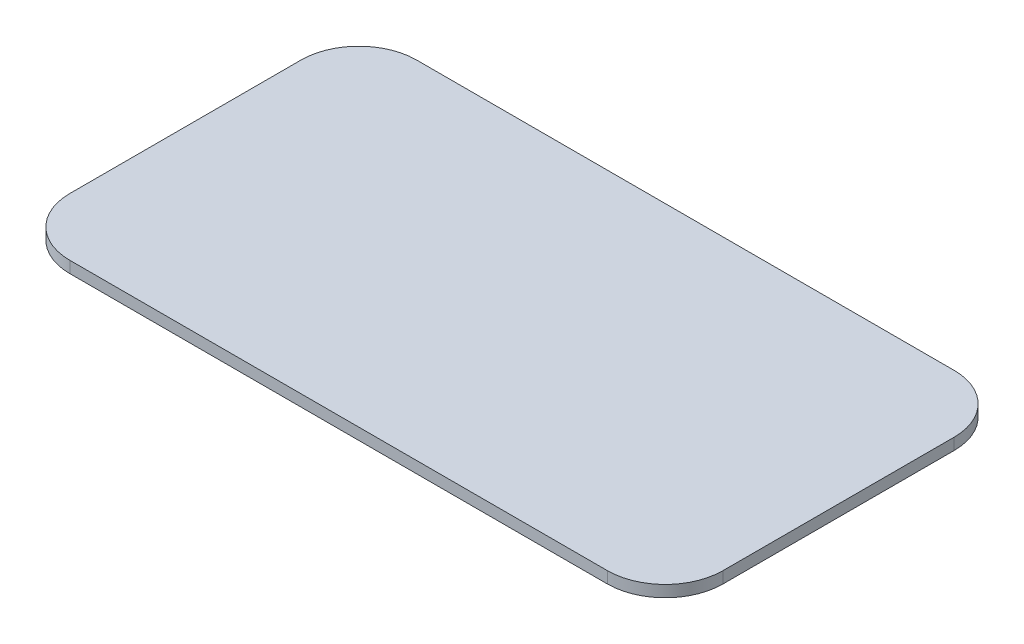
ISO-10303-21;
HEADER;
FILE_DESCRIPTION(('STEP AP214'),'2;1');
FILE_NAME('part.step','',(''),(''),'','','');
FILE_SCHEMA(('AUTOMOTIVE_DESIGN { 1 0 10303 214 1 1 1 1 }'));
ENDSEC;
DATA;
#1=APPLICATION_CONTEXT('core data for automotive mechanical design processes');
#2=APPLICATION_PROTOCOL_DEFINITION('international standard','automotive_design',2000,#1);
#3=PRODUCT_CONTEXT('',#1,'mechanical');
#4=PRODUCT('Part','Part','',(#3));
#5=PRODUCT_RELATED_PRODUCT_CATEGORY('part','',(#4));
#6=PRODUCT_DEFINITION_FORMATION('','',#4);
#7=PRODUCT_DEFINITION_CONTEXT('part definition',#1,'design');
#8=PRODUCT_DEFINITION('design','',#6,#7);
#9=PRODUCT_DEFINITION_SHAPE('','',#8);
#10=(LENGTH_UNIT() NAMED_UNIT(*) SI_UNIT(.MILLI.,.METRE.));
#11=(NAMED_UNIT(*) PLANE_ANGLE_UNIT() SI_UNIT($,.RADIAN.));
#12=(NAMED_UNIT(*) SI_UNIT($,.STERADIAN.) SOLID_ANGLE_UNIT());
#13=UNCERTAINTY_MEASURE_WITH_UNIT(LENGTH_MEASURE(1.E-05),#10,'distance_accuracy_value','');
#14=(GEOMETRIC_REPRESENTATION_CONTEXT(3) GLOBAL_UNCERTAINTY_ASSIGNED_CONTEXT((#13)) GLOBAL_UNIT_ASSIGNED_CONTEXT((#10,
#11,#12)) REPRESENTATION_CONTEXT('',''));
#15=CARTESIAN_POINT('',(0.,0.,0.));
#16=DIRECTION('',(0.,0.,1.));
#17=DIRECTION('',(1.,0.,0.));
#18=AXIS2_PLACEMENT_3D('',#15,#16,#17);
#19=CARTESIAN_POINT('',(79.785498489426,2.,-5.53323262839879));
#20=DIRECTION('',(0.,-1.,0.));
#21=DIRECTION('',(0.,0.,-1.));
#22=AXIS2_PLACEMENT_3D('',#19,#20,#21);
#23=CYLINDRICAL_SURFACE('',#22,10.);
#24=CARTESIAN_POINT('',(79.785498489426,0.,-5.53323262839879));
#25=DIRECTION('',(0.,1.,0.));
#26=DIRECTION('',(0.,0.,1.));
#27=AXIS2_PLACEMENT_3D('',#24,#25,#26);
#28=CIRCLE('',#27,10.);
#29=CARTESIAN_POINT('',(89.785498489426,0.,-5.53323262839872));
#30=VERTEX_POINT('',#29);
#31=CARTESIAN_POINT('',(79.7854984894259,0.,-15.5332326283988));
#32=VERTEX_POINT('',#31);
#33=EDGE_CURVE('E130',#30,#32,#28,.T.);
#34=ORIENTED_EDGE('',*,*,#33,.T.);
#35=DIRECTION('',(0.,-1.,0.));
#36=VECTOR('',#35,1.);
#37=CARTESIAN_POINT('',(79.7854984894259,2.,-15.5332326283988));
#38=LINE('',#37,#36);
#39=CARTESIAN_POINT('',(79.7854984894259,2.,-15.5332326283988));
#40=VERTEX_POINT('',#39);
#41=EDGE_CURVE('E11',#40,#32,#38,.T.);
#42=ORIENTED_EDGE('',*,*,#41,.F.);
#43=CARTESIAN_POINT('',(79.785498489426,2.,-5.53323262839879));
#44=DIRECTION('',(0.,1.,0.));
#45=DIRECTION('',(0.,0.,1.));
#46=AXIS2_PLACEMENT_3D('',#43,#44,#45);
#47=CIRCLE('',#46,10.);
#48=CARTESIAN_POINT('',(89.785498489426,2.,-5.53323262839872));
#49=VERTEX_POINT('',#48);
#50=EDGE_CURVE('E144',#49,#40,#47,.T.);
#51=ORIENTED_EDGE('',*,*,#50,.F.);
#52=DIRECTION('',(0.,-1.,0.));
#53=VECTOR('',#52,1.);
#54=CARTESIAN_POINT('',(89.785498489426,2.,-5.53323262839872));
#55=LINE('',#54,#53);
#56=EDGE_CURVE('E126',#49,#30,#55,.T.);
#57=ORIENTED_EDGE('',*,*,#56,.T.);
#58=EDGE_LOOP('',(#34,#42,#51,#57));
#59=FACE_BOUND('',#58,.T.);
#60=ADVANCED_FACE('F34',(#59),#23,.T.);
#61=CARTESIAN_POINT('',(-13.214501510574,2.,-15.5332326283988));
#62=DIRECTION('',(0.,0.,1.));
#63=DIRECTION('',(1.,0.,0.));
#64=AXIS2_PLACEMENT_3D('',#61,#62,#63);
#65=PLANE('',#64);
#66=DIRECTION('',(-1.,0.,0.));
#67=VECTOR('',#66,1.);
#68=CARTESIAN_POINT('',(-13.214501510574,0.,-15.5332326283988));
#69=LINE('',#68,#67);
#70=CARTESIAN_POINT('',(-13.214501510574,0.,-15.5332326283988));
#71=VERTEX_POINT('',#70);
#72=EDGE_CURVE('E133',#32,#71,#69,.T.);
#73=ORIENTED_EDGE('',*,*,#72,.T.);
#74=DIRECTION('',(0.,-1.,0.));
#75=VECTOR('',#74,1.);
#76=CARTESIAN_POINT('',(-13.214501510574,2.,-15.5332326283988));
#77=LINE('',#76,#75);
#78=CARTESIAN_POINT('',(-13.214501510574,2.,-15.5332326283988));
#79=VERTEX_POINT('',#78);
#80=EDGE_CURVE('E42',#79,#71,#77,.T.);
#81=ORIENTED_EDGE('',*,*,#80,.F.);
#82=DIRECTION('',(-1.,0.,0.));
#83=VECTOR('',#82,1.);
#84=CARTESIAN_POINT('',(-13.214501510574,2.,-15.5332326283988));
#85=LINE('',#84,#83);
#86=EDGE_CURVE('E93',#40,#79,#85,.T.);
#87=ORIENTED_EDGE('',*,*,#86,.F.);
#88=ORIENTED_EDGE('',*,*,#41,.T.);
#89=EDGE_LOOP('',(#73,#81,#87,#88));
#90=FACE_BOUND('',#89,.T.);
#91=ADVANCED_FACE('F179',(#90),#65,.F.);
#92=CARTESIAN_POINT('',(-13.214501510574,2.,-5.5332326283988));
#93=DIRECTION('',(0.,-1.,0.));
#94=DIRECTION('',(0.,0.,-1.));
#95=AXIS2_PLACEMENT_3D('',#92,#93,#94);
#96=CYLINDRICAL_SURFACE('',#95,10.);
#97=CARTESIAN_POINT('',(-13.214501510574,0.,-5.5332326283988));
#98=DIRECTION('',(0.,1.,0.));
#99=DIRECTION('',(0.,0.,-1.));
#100=AXIS2_PLACEMENT_3D('',#97,#98,#99);
#101=CIRCLE('',#100,10.);
#102=CARTESIAN_POINT('',(-23.214501510574,0.,-5.53323262839872));
#103=VERTEX_POINT('',#102);
#104=EDGE_CURVE('E135',#71,#103,#101,.T.);
#105=ORIENTED_EDGE('',*,*,#104,.T.);
#106=DIRECTION('',(0.,-1.,0.));
#107=VECTOR('',#106,1.);
#108=CARTESIAN_POINT('',(-23.214501510574,2.,-5.53323262839872));
#109=LINE('',#108,#107);
#110=CARTESIAN_POINT('',(-23.214501510574,2.,-5.53323262839872));
#111=VERTEX_POINT('',#110);
#112=EDGE_CURVE('E151',#111,#103,#109,.T.);
#113=ORIENTED_EDGE('',*,*,#112,.F.);
#114=CARTESIAN_POINT('',(-13.214501510574,2.,-5.5332326283988));
#115=DIRECTION('',(0.,1.,0.));
#116=DIRECTION('',(0.,0.,-1.));
#117=AXIS2_PLACEMENT_3D('',#114,#115,#116);
#118=CIRCLE('',#117,10.);
#119=EDGE_CURVE('E159',#79,#111,#118,.T.);
#120=ORIENTED_EDGE('',*,*,#119,.F.);
#121=ORIENTED_EDGE('',*,*,#80,.T.);
#122=EDGE_LOOP('',(#105,#113,#120,#121));
#123=FACE_BOUND('',#122,.T.);
#124=ADVANCED_FACE('F157',(#123),#96,.T.);
#125=CARTESIAN_POINT('',(-23.214501510574,2.,-5.53323262839872));
#126=DIRECTION('',(1.,0.,0.));
#127=DIRECTION('',(0.,0.,-1.));
#128=AXIS2_PLACEMENT_3D('',#125,#126,#127);
#129=PLANE('',#128);
#130=DIRECTION('',(0.,0.,1.));
#131=VECTOR('',#130,1.);
#132=CARTESIAN_POINT('',(-23.214501510574,0.,-5.53323262839872));
#133=LINE('',#132,#131);
#134=CARTESIAN_POINT('',(-23.214501510574,0.,34.4667673716011));
#135=VERTEX_POINT('',#134);
#136=EDGE_CURVE('E137',#103,#135,#133,.T.);
#137=ORIENTED_EDGE('',*,*,#136,.T.);
#138=DIRECTION('',(0.,-1.,0.));
#139=VECTOR('',#138,1.);
#140=CARTESIAN_POINT('',(-23.214501510574,2.,34.4667673716011));
#141=LINE('',#140,#139);
#142=CARTESIAN_POINT('',(-23.214501510574,2.,34.4667673716011));
#143=VERTEX_POINT('',#142);
#144=EDGE_CURVE('E148',#143,#135,#141,.T.);
#145=ORIENTED_EDGE('',*,*,#144,.F.);
#146=DIRECTION('',(0.,0.,1.));
#147=VECTOR('',#146,1.);
#148=CARTESIAN_POINT('',(-23.214501510574,2.,-5.53323262839872));
#149=LINE('',#148,#147);
#150=EDGE_CURVE('E171',#111,#143,#149,.T.);
#151=ORIENTED_EDGE('',*,*,#150,.F.);
#152=ORIENTED_EDGE('',*,*,#112,.T.);
#153=EDGE_LOOP('',(#137,#145,#151,#152));
#154=FACE_BOUND('',#153,.T.);
#155=ADVANCED_FACE('F167',(#154),#129,.F.);
#156=CARTESIAN_POINT('',(-13.214501510574,2.,34.4667673716012));
#157=DIRECTION('',(0.,-1.,0.));
#158=DIRECTION('',(0.,0.,-1.));
#159=AXIS2_PLACEMENT_3D('',#156,#157,#158);
#160=CYLINDRICAL_SURFACE('',#159,10.);
#161=CARTESIAN_POINT('',(-13.214501510574,0.,34.4667673716012));
#162=DIRECTION('',(0.,1.,0.));
#163=DIRECTION('',(0.,0.,-1.));
#164=AXIS2_PLACEMENT_3D('',#161,#162,#163);
#165=CIRCLE('',#164,10.);
#166=CARTESIAN_POINT('',(-13.214501510574,0.,44.4667673716012));
#167=VERTEX_POINT('',#166);
#168=EDGE_CURVE('E139',#135,#167,#165,.T.);
#169=ORIENTED_EDGE('',*,*,#168,.T.);
#170=DIRECTION('',(0.,-1.,0.));
#171=VECTOR('',#170,1.);
#172=CARTESIAN_POINT('',(-13.214501510574,2.,44.4667673716012));
#173=LINE('',#172,#171);
#174=CARTESIAN_POINT('',(-13.214501510574,2.,44.4667673716012));
#175=VERTEX_POINT('',#174);
#176=EDGE_CURVE('E121',#175,#167,#173,.T.);
#177=ORIENTED_EDGE('',*,*,#176,.F.);
#178=CARTESIAN_POINT('',(-13.214501510574,2.,34.4667673716012));
#179=DIRECTION('',(0.,1.,0.));
#180=DIRECTION('',(0.,0.,-1.));
#181=AXIS2_PLACEMENT_3D('',#178,#179,#180);
#182=CIRCLE('',#181,10.);
#183=EDGE_CURVE('E112',#143,#175,#182,.T.);
#184=ORIENTED_EDGE('',*,*,#183,.F.);
#185=ORIENTED_EDGE('',*,*,#144,.T.);
#186=EDGE_LOOP('',(#169,#177,#184,#185));
#187=FACE_BOUND('',#186,.T.);
#188=ADVANCED_FACE('F170',(#187),#160,.T.);
#189=CARTESIAN_POINT('',(-13.214501510574,2.,44.4667673716012));
#190=DIRECTION('',(0.,0.,-1.));
#191=DIRECTION('',(-1.,0.,0.));
#192=AXIS2_PLACEMENT_3D('',#189,#190,#191);
#193=PLANE('',#192);
#194=DIRECTION('',(1.,0.,0.));
#195=VECTOR('',#194,1.);
#196=CARTESIAN_POINT('',(-13.214501510574,0.,44.4667673716012));
#197=LINE('',#196,#195);
#198=CARTESIAN_POINT('',(79.7854984894259,0.,44.4667673716012));
#199=VERTEX_POINT('',#198);
#200=EDGE_CURVE('E120',#167,#199,#197,.T.);
#201=ORIENTED_EDGE('',*,*,#200,.T.);
#202=DIRECTION('',(0.,-1.,0.));
#203=VECTOR('',#202,1.);
#204=CARTESIAN_POINT('',(79.7854984894259,2.,44.4667673716012));
#205=LINE('',#204,#203);
#206=CARTESIAN_POINT('',(79.7854984894259,2.,44.4667673716012));
#207=VERTEX_POINT('',#206);
#208=EDGE_CURVE('E117',#207,#199,#205,.T.);
#209=ORIENTED_EDGE('',*,*,#208,.F.);
#210=DIRECTION('',(1.,0.,0.));
#211=VECTOR('',#210,1.);
#212=CARTESIAN_POINT('',(-13.214501510574,2.,44.4667673716012));
#213=LINE('',#212,#211);
#214=EDGE_CURVE('E106',#175,#207,#213,.T.);
#215=ORIENTED_EDGE('',*,*,#214,.F.);
#216=ORIENTED_EDGE('',*,*,#176,.T.);
#217=EDGE_LOOP('',(#201,#209,#215,#216));
#218=FACE_BOUND('',#217,.T.);
#219=ADVANCED_FACE('F118',(#218),#193,.F.);
#220=CARTESIAN_POINT('',(79.785498489426,2.,34.4667673716012));
#221=DIRECTION('',(0.,-1.,0.));
#222=DIRECTION('',(0.,0.,-1.));
#223=AXIS2_PLACEMENT_3D('',#220,#221,#222);
#224=CYLINDRICAL_SURFACE('',#223,10.);
#225=CARTESIAN_POINT('',(79.785498489426,0.,34.4667673716012));
#226=DIRECTION('',(0.,1.,0.));
#227=DIRECTION('',(0.,0.,-1.));
#228=AXIS2_PLACEMENT_3D('',#225,#226,#227);
#229=CIRCLE('',#228,10.);
#230=CARTESIAN_POINT('',(89.785498489426,0.,34.4667673716011));
#231=VERTEX_POINT('',#230);
#232=EDGE_CURVE('E79',#199,#231,#229,.T.);
#233=ORIENTED_EDGE('',*,*,#232,.T.);
#234=DIRECTION('',(0.,-1.,0.));
#235=VECTOR('',#234,1.);
#236=CARTESIAN_POINT('',(89.785498489426,2.,34.4667673716011));
#237=LINE('',#236,#235);
#238=CARTESIAN_POINT('',(89.785498489426,2.,34.4667673716011));
#239=VERTEX_POINT('',#238);
#240=EDGE_CURVE('E122',#239,#231,#237,.T.);
#241=ORIENTED_EDGE('',*,*,#240,.F.);
#242=CARTESIAN_POINT('',(79.785498489426,2.,34.4667673716012));
#243=DIRECTION('',(0.,1.,0.));
#244=DIRECTION('',(0.,0.,-1.));
#245=AXIS2_PLACEMENT_3D('',#242,#243,#244);
#246=CIRCLE('',#245,10.);
#247=EDGE_CURVE('E110',#207,#239,#246,.T.);
#248=ORIENTED_EDGE('',*,*,#247,.F.);
#249=ORIENTED_EDGE('',*,*,#208,.T.);
#250=EDGE_LOOP('',(#233,#241,#248,#249));
#251=FACE_BOUND('',#250,.T.);
#252=ADVANCED_FACE('F124',(#251),#224,.T.);
#253=CARTESIAN_POINT('',(89.785498489426,2.,-5.53323262839872));
#254=DIRECTION('',(-1.,0.,0.));
#255=DIRECTION('',(0.,0.,1.));
#256=AXIS2_PLACEMENT_3D('',#253,#254,#255);
#257=PLANE('',#256);
#258=DIRECTION('',(0.,0.,-1.));
#259=VECTOR('',#258,1.);
#260=CARTESIAN_POINT('',(89.785498489426,0.,-5.53323262839872));
#261=LINE('',#260,#259);
#262=EDGE_CURVE('E85',#231,#30,#261,.T.);
#263=ORIENTED_EDGE('',*,*,#262,.T.);
#264=ORIENTED_EDGE('',*,*,#56,.F.);
#265=DIRECTION('',(0.,0.,-1.));
#266=VECTOR('',#265,1.);
#267=CARTESIAN_POINT('',(89.785498489426,2.,-5.53323262839872));
#268=LINE('',#267,#266);
#269=EDGE_CURVE('E50',#239,#49,#268,.T.);
#270=ORIENTED_EDGE('',*,*,#269,.F.);
#271=ORIENTED_EDGE('',*,*,#240,.T.);
#272=EDGE_LOOP('',(#263,#264,#270,#271));
#273=FACE_BOUND('',#272,.T.);
#274=ADVANCED_FACE('F195',(#273),#257,.F.);
#275=CARTESIAN_POINT('',(79.785498489426,2.,-5.53323262839879));
#276=DIRECTION('',(0.,1.,0.));
#277=DIRECTION('',(0.,0.,1.));
#278=AXIS2_PLACEMENT_3D('',#275,#276,#277);
#279=PLANE('',#278);
#280=ORIENTED_EDGE('',*,*,#50,.T.);
#281=ORIENTED_EDGE('',*,*,#86,.T.);
#282=ORIENTED_EDGE('',*,*,#119,.T.);
#283=ORIENTED_EDGE('',*,*,#150,.T.);
#284=ORIENTED_EDGE('',*,*,#183,.T.);
#285=ORIENTED_EDGE('',*,*,#214,.T.);
#286=ORIENTED_EDGE('',*,*,#247,.T.);
#287=ORIENTED_EDGE('',*,*,#269,.T.);
#288=EDGE_LOOP('',(#280,#281,#282,#283,#284,#285,#286,#287));
#289=FACE_BOUND('',#288,.T.);
#290=ADVANCED_FACE('F108',(#289),#279,.T.);
#291=CARTESIAN_POINT('',(79.785498489426,0.,-5.53323262839879));
#292=DIRECTION('',(0.,1.,0.));
#293=DIRECTION('',(0.,0.,1.));
#294=AXIS2_PLACEMENT_3D('',#291,#292,#293);
#295=PLANE('',#294);
#296=ORIENTED_EDGE('',*,*,#33,.F.);
#297=ORIENTED_EDGE('',*,*,#262,.F.);
#298=ORIENTED_EDGE('',*,*,#232,.F.);
#299=ORIENTED_EDGE('',*,*,#200,.F.);
#300=ORIENTED_EDGE('',*,*,#168,.F.);
#301=ORIENTED_EDGE('',*,*,#136,.F.);
#302=ORIENTED_EDGE('',*,*,#104,.F.);
#303=ORIENTED_EDGE('',*,*,#72,.F.);
#304=EDGE_LOOP('',(#296,#297,#298,#299,#300,#301,#302,#303));
#305=FACE_BOUND('',#304,.T.);
#306=ADVANCED_FACE('F163',(#305),#295,.F.);
#307=CLOSED_SHELL('',(#60,#91,#124,#155,#188,#219,#252,#274,#290,#306));
#308=MANIFOLD_SOLID_BREP('B2',#307);
#309=ADVANCED_BREP_SHAPE_REPRESENTATION('',(#18,#308),#14);
#310=SHAPE_DEFINITION_REPRESENTATION(#9,#309);
ENDSEC;
END-ISO-10303-21;
